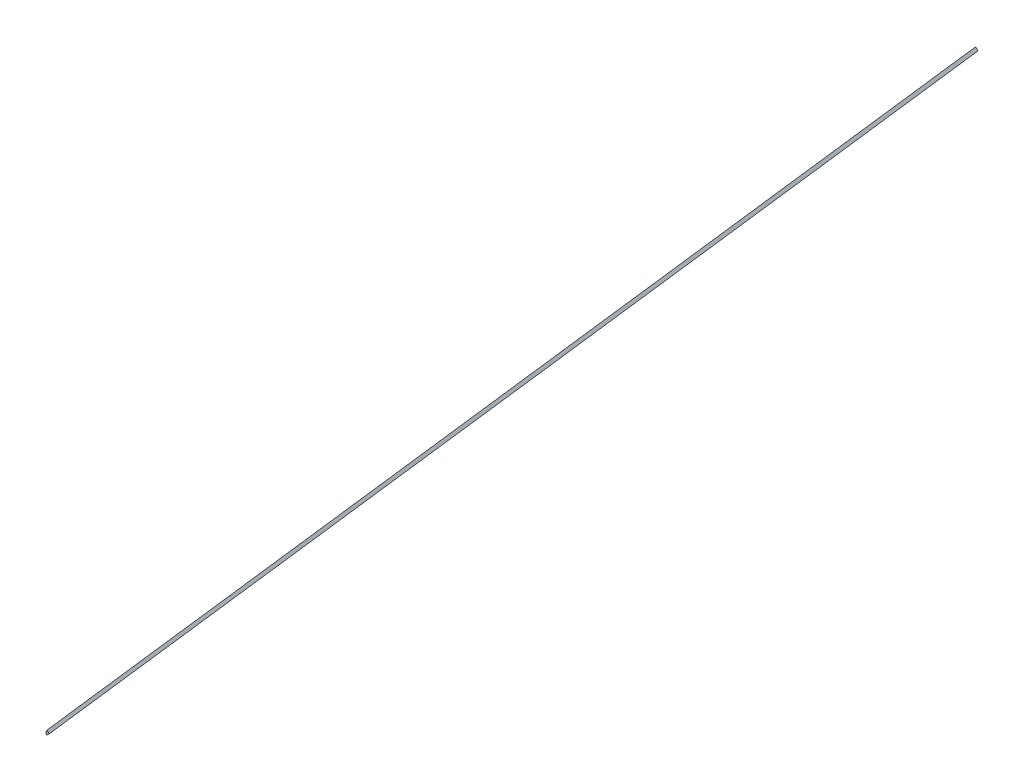
ISO-10303-21;
HEADER;
FILE_DESCRIPTION(('STEP AP214'),'2;1');
FILE_NAME('part.step','',(''),(''),'','','');
FILE_SCHEMA(('AUTOMOTIVE_DESIGN { 1 0 10303 214 1 1 1 1 }'));
ENDSEC;
DATA;
#1=APPLICATION_CONTEXT('core data for automotive mechanical design processes');
#2=APPLICATION_PROTOCOL_DEFINITION('international standard','automotive_design',2000,#1);
#3=PRODUCT_CONTEXT('',#1,'mechanical');
#4=PRODUCT('Part','Part','',(#3));
#5=PRODUCT_RELATED_PRODUCT_CATEGORY('part','',(#4));
#6=PRODUCT_DEFINITION_FORMATION('','',#4);
#7=PRODUCT_DEFINITION_CONTEXT('part definition',#1,'design');
#8=PRODUCT_DEFINITION('design','',#6,#7);
#9=PRODUCT_DEFINITION_SHAPE('','',#8);
#10=(LENGTH_UNIT() NAMED_UNIT(*) SI_UNIT(.MILLI.,.METRE.));
#11=(NAMED_UNIT(*) PLANE_ANGLE_UNIT() SI_UNIT($,.RADIAN.));
#12=(NAMED_UNIT(*) SI_UNIT($,.STERADIAN.) SOLID_ANGLE_UNIT());
#13=UNCERTAINTY_MEASURE_WITH_UNIT(LENGTH_MEASURE(1.E-05),#10,'distance_accuracy_value','');
#14=(GEOMETRIC_REPRESENTATION_CONTEXT(3) GLOBAL_UNCERTAINTY_ASSIGNED_CONTEXT((#13)) GLOBAL_UNIT_ASSIGNED_CONTEXT((#10,
#11,#12)) REPRESENTATION_CONTEXT('',''));
#15=CARTESIAN_POINT('',(0.,0.,0.));
#16=DIRECTION('',(0.,0.,1.));
#17=DIRECTION('',(1.,0.,0.));
#18=AXIS2_PLACEMENT_3D('',#15,#16,#17);
#19=CARTESIAN_POINT('',(114.57260961941,-0.0622199366800662,329.));
#20=CARTESIAN_POINT('',(114.4,-0.06856,0.));
#21=CARTESIAN_POINT('',(112.977295975491,-0.120816841951953,329.));
#22=CARTESIAN_POINT('',(111.965716629161,-0.157972807713173,0.));
#23=CARTESIAN_POINT('',(109.786644863781,-0.237979796076084,329.));
#24=CARTESIAN_POINT('',(107.097110694278,-0.336751805766281,0.));
#25=CARTESIAN_POINT('',(105.000693099298,-0.413750156151413,329.000000000001));
#26=CARTESIAN_POINT('',(99.7942412380696,-0.604959601121479,0.));
#27=CARTESIAN_POINT('',(100.214728756306,-0.589510986458513,329.));
#28=CARTESIAN_POINT('',(92.4913536383134,-0.8731494297109,0.));
#29=CARTESIAN_POINT('',(96.2264313571632,-0.735983254405373,329.));
#30=CARTESIAN_POINT('',(86.4056226452766,-1.09665710687671,0.));
#31=CARTESIAN_POINT('',(93.0357910844883,-0.85316110543344,329.));
#32=CARTESIAN_POINT('',(81.5370332937189,-1.27545083091915,0.));
#33=CARTESIAN_POINT('',(90.6428111354104,-0.941052950988877,329.));
#34=CARTESIAN_POINT('',(77.885594217603,-1.40956958634636,0.));
#35=CARTESIAN_POINT('',(88.2498328738692,-1.0289616927778,329.));
#36=CARTESIAN_POINT('',(74.2341544850718,-1.5437082159473,0.));
#37=CARTESIAN_POINT('',(85.856852391205,-1.11683664511502,329.));
#38=CARTESIAN_POINT('',(70.5827135432517,-1.67779370490371,0.));
#39=CARTESIAN_POINT('',(83.4638704721177,-1.2046573139067,329.));
#40=CARTESIAN_POINT('',(66.9312695396541,-1.81180573537152,0.));
#41=CARTESIAN_POINT('',(81.0708879975479,-1.29247078457698,329.));
#42=CARTESIAN_POINT('',(63.2798246772732,-1.94578905588669,0.));
#43=CARTESIAN_POINT('',(78.6779074851115,-1.38033351483244,329.));
#44=CARTESIAN_POINT('',(59.6283831410075,-2.07986597687277,0.));
#45=CARTESIAN_POINT('',(76.284934331329,-1.46839890937835,329.));
#46=CARTESIAN_POINT('',(55.9769530860873,-2.21425367726004,0.));
#47=CARTESIAN_POINT('',(73.8919664634316,-1.55660594759836,329.000000000001));
#48=CARTESIAN_POINT('',(52.3255302758724,-2.34883859679651,0.));
#49=CARTESIAN_POINT('',(71.4989899683453,-1.64458072330846,328.999999999999));
#50=CARTESIAN_POINT('',(48.6740949273067,-2.48308328284724,0.));
#51=CARTESIAN_POINT('',(69.105989839964,-1.73190836915481,329.000000000001));
#52=CARTESIAN_POINT('',(45.022623273531,-2.61633760751869,0.));
#53=CARTESIAN_POINT('',(66.7129651493619,-1.81856384168044,328.999999999999));
#54=CARTESIAN_POINT('',(41.3711135439631,-2.74854338410483,0.));
#55=CARTESIAN_POINT('',(64.3199669373025,-1.90594191039954,329.000000000001));
#56=CARTESIAN_POINT('',(37.7196460479609,-2.88191417837728,0.));
#57=CARTESIAN_POINT('',(62.3258668299447,-1.98053661442866,329.));
#58=CARTESIAN_POINT('',(34.6768527696352,-2.99567203272385,0.));
#59=CARTESIAN_POINT('',(60.7306395653596,-2.04158861078398,329.));
#60=CARTESIAN_POINT('',(32.2427036249245,-3.08892865656621,0.));
#61=CARTESIAN_POINT('',(59.5341984389728,-2.0868333620039,329.));
#62=CARTESIAN_POINT('',(30.4170537095853,-3.15787478213016,0.));
#63=CARTESIAN_POINT('',(58.3376895460393,-2.13030150456465,329.));
#64=CARTESIAN_POINT('',(28.5913075746204,-3.22423675912527,0.));
#65=CARTESIAN_POINT('',(57.1410810890218,-2.17088745999478,329.));
#66=CARTESIAN_POINT('',(26.7654048989622,-3.2861862573127,0.));
#67=CARTESIAN_POINT('',(55.9443412703829,-2.20748564982281,329.));
#68=CARTESIAN_POINT('',(24.9393037637721,-3.3420032780021,0.));
#69=CARTESIAN_POINT('',(54.7474529311727,-2.23888966087624,329.));
#70=CARTESIAN_POINT('',(23.1129754350255,-3.38993650770668,0.));
#71=CARTESIAN_POINT('',(53.5504153162138,-2.26397201099151,329.));
#72=CARTESIAN_POINT('',(21.2864190315302,-3.42820995119329,0.));
#73=CARTESIAN_POINT('',(52.353232928687,-2.28124339291768,328.999999999999));
#74=CARTESIAN_POINT('',(19.4596429108321,-3.4545494980358,0.));
#75=CARTESIAN_POINT('',(51.15595355233,-2.288861920351,329.000000000001));
#76=CARTESIAN_POINT('',(17.6327163554305,-3.46619351578578,0.));
#77=CARTESIAN_POINT('',(49.9586406141466,-2.28571853254573,329.));
#78=CARTESIAN_POINT('',(15.8057424311789,-3.46135030596471,0.));
#79=CARTESIAN_POINT('',(48.7614456222737,-2.26913668236569,328.999999999999));
#80=CARTESIAN_POINT('',(13.9789412855685,-3.43617298193985,0.));
#81=CARTESIAN_POINT('',(47.5644880850567,-2.23954580418405,329.000000000001));
#82=CARTESIAN_POINT('',(12.1525159866253,-3.39081697985119,0.));
#83=CARTESIAN_POINT('',(46.3681294391765,-2.19096327836138,328.999999999999));
#84=CARTESIAN_POINT('',(10.3269829850202,-3.31692842661875,0.));
#85=CARTESIAN_POINT('',(45.1723870805993,-2.13077185247814,329.000000000001));
#86=CARTESIAN_POINT('',(8.50241829521622,-3.22500915813475,0.));
#87=CARTESIAN_POINT('',(44.1766473883666,-2.06485136570954,328.999999999999));
#88=CARTESIAN_POINT('',(6.98300428865084,-3.12433212750466,0.));
#89=CARTESIAN_POINT('',(43.3830893437349,-1.97750102636705,329.000000000001));
#90=CARTESIAN_POINT('',(5.77213418222719,-2.99109577573727,0.));
#91=CARTESIAN_POINT('',(42.7903884171788,-1.89255413261195,328.999999999999));
#92=CARTESIAN_POINT('',(4.86771256745936,-2.86147635484054,0.));
#93=CARTESIAN_POINT('',(42.2018621119385,-1.78259761794642,329.000000000001));
#94=CARTESIAN_POINT('',(3.96972156813326,-2.69356724495905,0.));
#95=CARTESIAN_POINT('',(41.6144368512239,-1.66711733291326,328.999999999999));
#96=CARTESIAN_POINT('',(3.07329938019767,-2.5176539368822,0.));
#97=CARTESIAN_POINT('',(41.030721908302,-1.53296410466494,329.000000000001));
#98=CARTESIAN_POINT('',(2.18268391666198,-2.3127837560272,0.));
#99=CARTESIAN_POINT('',(40.5658570608416,-1.34296250191487,328.999999999999));
#100=CARTESIAN_POINT('',(1.47329929331152,-2.02281116106069,0.));
#101=CARTESIAN_POINT('',(40.2328838259331,-1.12111197664618,329.));
#102=CARTESIAN_POINT('',(0.965300946177489,-1.68427874419331,0.));
#103=CARTESIAN_POINT('',(40.0045523416234,-0.926760940944612,329.));
#104=CARTESIAN_POINT('',(0.616853662639164,-1.38773413128347,0.));
#105=CARTESIAN_POINT('',(39.8058884927858,-0.701609182245043,329.));
#106=CARTESIAN_POINT('',(0.313781760209367,-1.04410645837054,0.));
#107=CARTESIAN_POINT('',(39.6506080929225,-0.443706027629307,329.));
#108=CARTESIAN_POINT('',(0.0769541024066916,-0.650538017604325,0.));
#109=CARTESIAN_POINT('',(39.5764905355394,-0.148134503442184,329.));
#110=CARTESIAN_POINT('',(-0.0364245156961572,-0.199715317390292,0.));
#111=CARTESIAN_POINT('',(39.6212379263324,0.152906641389699,329.));
#112=CARTESIAN_POINT('',(0.0320651688817571,0.259740207343021,0.));
#113=CARTESIAN_POINT('',(39.7462731745835,0.426434812966566,329.));
#114=CARTESIAN_POINT('',(0.222717607662432,0.677061995084372,0.));
#115=CARTESIAN_POINT('',(39.9118284437912,0.676489937329452,329.));
#116=CARTESIAN_POINT('',(0.475409900417133,1.05859895915268,0.));
#117=CARTESIAN_POINT('',(40.1020297991035,0.907946183502351,329.));
#118=CARTESIAN_POINT('',(0.765550841982641,1.41183330248373,0.));
#119=CARTESIAN_POINT('',(40.3058904903587,1.12719115072782,329.));
#120=CARTESIAN_POINT('',(1.07673483260303,1.74628416301866,0.));
#121=CARTESIAN_POINT('',(40.5170780992003,1.33935694664796,329.));
#122=CARTESIAN_POINT('',(1.39880128657276,2.07019260086103,0.));
#123=CARTESIAN_POINT('',(40.7305626383487,1.54914088404984,329.));
#124=CARTESIAN_POINT('',(1.72484435432684,2.39003706317112,0.));
#125=CARTESIAN_POINT('',(40.9491748450726,1.75369770525246,329.));
#126=CARTESIAN_POINT('',(2.05806352461083,2.70249872806248,0.));
#127=CARTESIAN_POINT('',(41.2491898335489,2.01693149821586,329.));
#128=CARTESIAN_POINT('',(2.51618795565956,3.10386363754482,0.));
#129=CARTESIAN_POINT('',(41.6433845733717,2.32338414751801,329.));
#130=CARTESIAN_POINT('',(3.11744388388253,3.57170414689077,0.));
#131=CARTESIAN_POINT('',(42.1419159584038,2.65541038243405,329.));
#132=CARTESIAN_POINT('',(3.87827233736804,4.07822471273745,0.));
#133=CARTESIAN_POINT('',(42.6603325762503,2.95527445622198,329.));
#134=CARTESIAN_POINT('',(4.66927623600314,4.53582075141618,0.));
#135=CARTESIAN_POINT('',(43.1920051006209,3.23067304723329,329.));
#136=CARTESIAN_POINT('',(5.48057328365004,4.95603831197717,0.));
#137=CARTESIAN_POINT('',(43.73461712113,3.48384959688034,329.000000000001));
#138=CARTESIAN_POINT('',(6.30853823898846,5.34236268864598,0.));
#139=CARTESIAN_POINT('',(44.2853103695626,3.71876278425974,328.999999999999));
#140=CARTESIAN_POINT('',(7.14883728112551,5.70082045708303,0.));
#141=CARTESIAN_POINT('',(44.842102539349,3.93881445027894,329.));
#142=CARTESIAN_POINT('',(7.99844900100825,6.03659176034702,0.));
#143=CARTESIAN_POINT('',(45.4037436656897,4.14611278204335,329.));
#144=CARTESIAN_POINT('',(8.85544440881743,6.3529290932593,0.));
#145=CARTESIAN_POINT('',(45.9688602827349,4.34370744577013,329.));
#146=CARTESIAN_POINT('',(9.71777798239826,6.65438937250343,0.));
#147=CARTESIAN_POINT('',(46.5371284585512,4.53207887325267,329.));
#148=CARTESIAN_POINT('',(10.5848518324099,6.94191487900306,0.));
#149=CARTESIAN_POINT('',(47.2989015018565,4.77055534918493,329.));
#150=CARTESIAN_POINT('',(11.7472766809127,7.30570333780045,0.));
#151=CARTESIAN_POINT('',(48.2585469423734,5.04413868204417,329.));
#152=CARTESIAN_POINT('',(13.2115681037735,7.72323418873163,0.));
#153=CARTESIAN_POINT('',(49.4194455039909,5.33759135782374,329.));
#154=CARTESIAN_POINT('',(14.9829959141197,8.17097094627978,0.));
#155=CARTESIAN_POINT('',(50.5876889588109,5.60017543141388,329.));
#156=CARTESIAN_POINT('',(16.7656063461902,8.57166989486869,0.));
#157=CARTESIAN_POINT('',(51.7618910786936,5.83463957492898,329.));
#158=CARTESIAN_POINT('',(18.5573221255501,8.92942802521701,0.));
#159=CARTESIAN_POINT('',(52.9413793027427,6.04087523248973,329.));
#160=CARTESIAN_POINT('',(20.357097215315,9.24412694329611,0.));
#161=CARTESIAN_POINT('',(54.1256039736483,6.21798437376885,328.999999999999));
#162=CARTESIAN_POINT('',(22.1641029633317,9.51437922323504,0.));
#163=CARTESIAN_POINT('',(55.7101440829799,6.41328251131465,329.000000000001));
#164=CARTESIAN_POINT('',(24.581947434041,9.81237724369643,0.));
#165=CARTESIAN_POINT('',(57.6983353941993,6.58884014267491,328.999999999999));
#166=CARTESIAN_POINT('',(27.6157220253602,10.0802867880787,0.));
#167=CARTESIAN_POINT('',(60.089648548173,6.7178868839627,329.));
#168=CARTESIAN_POINT('',(31.2646245807487,10.2771026229954,0.));
#169=CARTESIAN_POINT('',(62.4830008435416,6.79713214430168,329.));
#170=CARTESIAN_POINT('',(34.9166302660792,10.3980954427901,0.));
#171=CARTESIAN_POINT('',(64.8771108097576,6.8473589228501,329.));
#172=CARTESIAN_POINT('',(38.5697944561475,10.4747486999319,0.));
#173=CARTESIAN_POINT('',(67.2717857562776,6.85811026179045,329.));
#174=CARTESIAN_POINT('',(42.2238222521298,10.4911444745235,0.));
#175=CARTESIAN_POINT('',(69.6662566295519,6.82456608957842,329.));
#176=CARTESIAN_POINT('',(45.8775382661358,10.4399604287515,0.));
#177=CARTESIAN_POINT('',(72.0595159941657,6.74076018787565,329.));
#178=CARTESIAN_POINT('',(49.5294044274174,10.3120908518743,0.));
#179=CARTESIAN_POINT('',(74.4507854867059,6.61312441778202,329.));
#180=CARTESIAN_POINT('',(53.178236653511,10.1173287938002,0.));
#181=CARTESIAN_POINT('',(76.83962110388,6.44606051592298,329.));
#182=CARTESIAN_POINT('',(56.8233498066736,9.86239123421157,0.));
#183=CARTESIAN_POINT('',(79.2257994806511,6.24485556975728,329.));
#184=CARTESIAN_POINT('',(60.4644197278447,9.55540656456613,0.));
#185=CARTESIAN_POINT('',(81.608883892125,6.00968462430416,329.));
#186=CARTESIAN_POINT('',(64.1007467162242,9.19649996426467,0.));
#187=CARTESIAN_POINT('',(83.9884067169117,5.74098583428185,329.));
#188=CARTESIAN_POINT('',(67.7316796667099,8.78660201096427,0.));
#189=CARTESIAN_POINT('',(86.3639430060132,5.43895442797606,329.));
#190=CARTESIAN_POINT('',(71.35645846618,8.32555431852534,0.));
#191=CARTESIAN_POINT('',(88.7353798020637,5.10654326179853,329.));
#192=CARTESIAN_POINT('',(74.9750949806674,7.81858317834956,0.));
#193=CARTESIAN_POINT('',(91.1029623317014,4.74754064005611,329.));
#194=CARTESIAN_POINT('',(78.587697519638,7.27053006377924,0.));
#195=CARTESIAN_POINT('',(93.4669358215645,4.36573486705565,329.));
#196=CARTESIAN_POINT('',(82.1949389593251,6.68807069894766,0.));
#197=CARTESIAN_POINT('',(96.6140720283502,3.82758553402491,329.));
#198=CARTESIAN_POINT('',(86.9971156579425,5.86690602257278,0.));
#199=CARTESIAN_POINT('',(100.5389082124,3.10287561201863,329.));
#200=CARTESIAN_POINT('',(92.98602152733,4.761034593382,0.));
#201=CARTESIAN_POINT('',(105.23248636945,2.15016018644571,329.));
#202=CARTESIAN_POINT('',(100.147932525585,3.30731157548085,0.));
#203=CARTESIAN_POINT('',(109.912024284167,1.13032636467303,329.));
#204=CARTESIAN_POINT('',(107.288427475213,1.75113882040688,0.));
#205=CARTESIAN_POINT('',(113.019270648536,0.395869046271625,329.));
#206=CARTESIAN_POINT('',(112.029765632302,0.630436336958154,0.));
#207=CARTESIAN_POINT('',(114.600066449668,0.0211332115694607,329.));
#208=CARTESIAN_POINT('',(114.441896278871,0.0586282700306697,0.));
#209=CARTESIAN_POINT('',(114.654664571062,0.00819044402219781,329.));
#210=CARTESIAN_POINT('',(114.525207356504,0.03887894744609,0.));
#211=CARTESIAN_POINT('',(114.736719522714,-0.0112611073904201,329.));
#212=CARTESIAN_POINT('',(114.650414713008,0.00919789489218184,0.));
#213=CARTESIAN_POINT('',(114.818774474365,-0.0307126588030327,329.));
#214=CARTESIAN_POINT('',(114.775622069512,-0.0204831576617346,0.));
#215=CARTESIAN_POINT('',(114.873477775466,-0.0436803597447778,329.));
#216=CARTESIAN_POINT('',(114.859093640515,-0.0402705260310117,0.));
#217=CARTESIAN_POINT('',(114.900829426016,-0.0501642102156497,329.));
#218=CARTESIAN_POINT('',(114.900829426016,-0.0501642102156497,0.));
#219=B_SPLINE_SURFACE_WITH_KNOTS('',3,1,((#19,#20),(#21,#22),(#23,#24),(#25,#26),(#27,#28),(#29,
#30),(#31,#32),(#33,#34),(#35,#36),(#37,#38),(#39,#40),(#41,#42),(#43,#44),(#45,#46),(#47,#48),
(#49,#50),(#51,#52),(#53,#54),(#55,#56),(#57,#58),(#59,#60),(#61,#62),(#63,#64),(#65,#66),(#67,
#68),(#69,#70),(#71,#72),(#73,#74),(#75,#76),(#77,#78),(#79,#80),(#81,#82),(#83,#84),(#85,#86),
(#87,#88),(#89,#90),(#91,#92),(#93,#94),(#95,#96),(#97,#98),(#99,#100),(#101,#102),(#103,#104),
(#105,#106),(#107,#108),(#109,#110),(#111,#112),(#113,#114),(#115,#116),(#117,#118),(#119,#120),
(#121,#122),(#123,#124),(#125,#126),(#127,#128),(#129,#130),(#131,#132),(#133,#134),(#135,#136),
(#137,#138),(#139,#140),(#141,#142),(#143,#144),(#145,#146),(#147,#148),(#149,#150),(#151,#152),
(#153,#154),(#155,#156),(#157,#158),(#159,#160),(#161,#162),(#163,#164),(#165,#166),(#167,#168),
(#169,#170),(#171,#172),(#173,#174),(#175,#176),(#177,#178),(#179,#180),(#181,#182),(#183,#184),
(#185,#186),(#187,#188),(#189,#190),(#191,#192),(#193,#194),(#195,#196),(#197,#198),(#199,#200),
(#201,#202),(#203,#204),(#205,#206),(#207,#208),(#209,#210),(#211,#212),(#213,#214),(#215,#216),
(#217,#218)),.UNSPECIFIED.,.F.,.F.,.F.,(4,1,1,1,1,1,1,1,1,1,1,1,1,1,1,1,1,1,1,1,1,1,1,1,1,1,1,1,
1,1,1,1,1,1,1,1,1,1,1,1,1,1,1,1,1,1,1,1,1,1,1,1,1,1,1,1,1,1,1,1,1,1,1,1,1,1,1,1,1,1,1,1,1,1,1,1,
1,1,1,1,1,1,1,1,1,1,1,1,1,1,1,1,2,1,1,1,4),(2,2),(0.,0.0311811053211745,0.0623622106423489,
0.0935433159635234,0.124724421284698,0.140314973945285,0.155905526605872,0.17149607926646,
0.187086631927047,0.202677184587634,0.218267737248221,0.233858289908809,0.249448842569396,
0.265039395229983,0.28062994789057,0.296220500551158,0.311811053211745,0.327401605872332,
0.342992158532919,0.350787434863213,0.358582711193506,0.3663779875238,0.374173263854094,
0.381968540184387,0.389763816514681,0.397559092844974,0.405354369175268,0.413149645505562,
0.420944921835855,0.428740198166149,0.436535474496443,0.444330750826736,0.45212602715703,
0.459921303487323,0.46381894165247,0.467716579817617,0.471614217982764,0.475511856147911,
0.479409494313058,0.483307132478204,0.485255951560778,0.487204770643351,0.489153589725925,
0.491102408808498,0.493051227891071,0.495000046973645,0.496948866056218,0.498897685138791,
0.500846504221365,0.502795323303939,0.504744142386512,0.506692961469085,0.508641780551659,
0.510590599634232,0.514488237799379,0.518385875964525,0.522283514129673,0.526181152294819,
0.530078790459966,0.533976428625113,0.53787406679026,0.541771704955407,0.545669343120553,
0.5495669812857,0.553464619450847,0.561259895781141,0.569055172111434,0.576850448441728,
0.584645724772021,0.592441001102315,0.600236277432609,0.608031553762902,0.62362210642349,
0.639212659084077,0.654803211744664,0.670393764405251,0.685984317065839,0.701574869726425,
0.717165422387013,0.7327559750476,0.748346527708187,0.763937080368774,0.779527633029362,
0.795118185689949,0.810708738350536,0.826299291011123,0.841889843671711,0.857480396332298,
0.873070948992885,0.90425205431406,0.935433159635234,0.966614264956409,0.997795370277583,
0.998346527708187,0.998897685138791,0.999448842569396,1.),(0.,1.),.UNSPECIFIED.);
#220=CARTESIAN_POINT('',(114.4,-0.06856,0.));
#221=CARTESIAN_POINT('',(111.965716629161,-0.157972807713173,0.));
#222=CARTESIAN_POINT('',(107.097110694278,-0.336751805766281,0.));
#223=CARTESIAN_POINT('',(99.7942412380696,-0.604959601121479,0.));
#224=CARTESIAN_POINT('',(92.4913536383134,-0.8731494297109,0.));
#225=CARTESIAN_POINT('',(86.4056226452766,-1.09665710687671,0.));
#226=CARTESIAN_POINT('',(81.5370332937189,-1.27545083091915,0.));
#227=CARTESIAN_POINT('',(77.885594217603,-1.40956958634636,0.));
#228=CARTESIAN_POINT('',(74.2341544850718,-1.5437082159473,0.));
#229=CARTESIAN_POINT('',(70.5827135432517,-1.67779370490371,0.));
#230=CARTESIAN_POINT('',(66.9312695396541,-1.81180573537152,0.));
#231=CARTESIAN_POINT('',(63.2798246772732,-1.94578905588669,0.));
#232=CARTESIAN_POINT('',(59.6283831410075,-2.07986597687277,0.));
#233=CARTESIAN_POINT('',(55.9769530860873,-2.21425367726004,0.));
#234=CARTESIAN_POINT('',(52.3255302758724,-2.34883859679651,0.));
#235=CARTESIAN_POINT('',(48.6740949273067,-2.48308328284724,0.));
#236=CARTESIAN_POINT('',(45.022623273531,-2.61633760751869,0.));
#237=CARTESIAN_POINT('',(41.3711135439631,-2.74854338410483,0.));
#238=CARTESIAN_POINT('',(37.7196460479609,-2.88191417837728,0.));
#239=CARTESIAN_POINT('',(34.6768527696352,-2.99567203272385,0.));
#240=CARTESIAN_POINT('',(32.2427036249245,-3.08892865656621,0.));
#241=CARTESIAN_POINT('',(30.4170537095853,-3.15787478213016,0.));
#242=CARTESIAN_POINT('',(28.5913075746204,-3.22423675912527,0.));
#243=CARTESIAN_POINT('',(26.7654048989622,-3.2861862573127,0.));
#244=CARTESIAN_POINT('',(24.9393037637721,-3.3420032780021,0.));
#245=CARTESIAN_POINT('',(23.1129754350255,-3.38993650770668,0.));
#246=CARTESIAN_POINT('',(21.2864190315302,-3.42820995119329,0.));
#247=CARTESIAN_POINT('',(19.4596429108321,-3.4545494980358,0.));
#248=CARTESIAN_POINT('',(17.6327163554305,-3.46619351578578,0.));
#249=CARTESIAN_POINT('',(15.8057424311789,-3.46135030596471,0.));
#250=CARTESIAN_POINT('',(13.9789412855685,-3.43617298193985,0.));
#251=CARTESIAN_POINT('',(12.1525159866253,-3.39081697985119,0.));
#252=CARTESIAN_POINT('',(10.3269829850202,-3.31692842661875,0.));
#253=CARTESIAN_POINT('',(8.50241829521622,-3.22500915813475,0.));
#254=CARTESIAN_POINT('',(6.98300428865084,-3.12433212750466,0.));
#255=CARTESIAN_POINT('',(5.77213418222719,-2.99109577573727,0.));
#256=CARTESIAN_POINT('',(4.86771256745936,-2.86147635484054,0.));
#257=CARTESIAN_POINT('',(3.96972156813326,-2.69356724495905,0.));
#258=CARTESIAN_POINT('',(3.07329938019767,-2.5176539368822,0.));
#259=CARTESIAN_POINT('',(2.18268391666198,-2.3127837560272,0.));
#260=CARTESIAN_POINT('',(1.47329929331152,-2.02281116106069,0.));
#261=CARTESIAN_POINT('',(0.965300946177489,-1.68427874419331,0.));
#262=CARTESIAN_POINT('',(0.616853662639164,-1.38773413128347,0.));
#263=CARTESIAN_POINT('',(0.313781760209367,-1.04410645837054,0.));
#264=CARTESIAN_POINT('',(0.0769541024066916,-0.650538017604325,0.));
#265=CARTESIAN_POINT('',(-0.0364245156961572,-0.199715317390292,0.));
#266=CARTESIAN_POINT('',(0.0320651688817571,0.259740207343021,0.));
#267=CARTESIAN_POINT('',(0.222717607662432,0.677061995084372,0.));
#268=CARTESIAN_POINT('',(0.475409900417133,1.05859895915268,0.));
#269=CARTESIAN_POINT('',(0.765550841982641,1.41183330248373,0.));
#270=CARTESIAN_POINT('',(1.07673483260303,1.74628416301866,0.));
#271=CARTESIAN_POINT('',(1.39880128657276,2.07019260086103,0.));
#272=CARTESIAN_POINT('',(1.72484435432684,2.39003706317112,0.));
#273=CARTESIAN_POINT('',(2.05806352461083,2.70249872806248,0.));
#274=CARTESIAN_POINT('',(2.51618795565956,3.10386363754482,0.));
#275=CARTESIAN_POINT('',(3.11744388388253,3.57170414689077,0.));
#276=CARTESIAN_POINT('',(3.87827233736804,4.07822471273745,0.));
#277=CARTESIAN_POINT('',(4.66927623600314,4.53582075141618,0.));
#278=CARTESIAN_POINT('',(5.48057328365004,4.95603831197717,0.));
#279=CARTESIAN_POINT('',(6.30853823898846,5.34236268864598,0.));
#280=CARTESIAN_POINT('',(7.14883728112551,5.70082045708303,0.));
#281=CARTESIAN_POINT('',(7.99844900100825,6.03659176034702,0.));
#282=CARTESIAN_POINT('',(8.85544440881743,6.3529290932593,0.));
#283=CARTESIAN_POINT('',(9.71777798239826,6.65438937250343,0.));
#284=CARTESIAN_POINT('',(10.5848518324099,6.94191487900306,0.));
#285=CARTESIAN_POINT('',(11.7472766809127,7.30570333780045,0.));
#286=CARTESIAN_POINT('',(13.2115681037735,7.72323418873163,0.));
#287=CARTESIAN_POINT('',(14.9829959141197,8.17097094627978,0.));
#288=CARTESIAN_POINT('',(16.7656063461902,8.57166989486869,0.));
#289=CARTESIAN_POINT('',(18.5573221255501,8.92942802521701,0.));
#290=CARTESIAN_POINT('',(20.357097215315,9.24412694329611,0.));
#291=CARTESIAN_POINT('',(22.1641029633317,9.51437922323504,0.));
#292=CARTESIAN_POINT('',(24.581947434041,9.81237724369643,0.));
#293=CARTESIAN_POINT('',(27.6157220253602,10.0802867880787,0.));
#294=CARTESIAN_POINT('',(31.2646245807487,10.2771026229954,0.));
#295=CARTESIAN_POINT('',(34.9166302660792,10.3980954427901,0.));
#296=CARTESIAN_POINT('',(38.5697944561475,10.4747486999319,0.));
#297=CARTESIAN_POINT('',(42.2238222521298,10.4911444745235,0.));
#298=CARTESIAN_POINT('',(45.8775382661358,10.4399604287515,0.));
#299=CARTESIAN_POINT('',(49.5294044274174,10.3120908518743,0.));
#300=CARTESIAN_POINT('',(53.178236653511,10.1173287938002,0.));
#301=CARTESIAN_POINT('',(56.8233498066736,9.86239123421157,0.));
#302=CARTESIAN_POINT('',(60.4644197278447,9.55540656456613,0.));
#303=CARTESIAN_POINT('',(64.1007467162242,9.19649996426467,0.));
#304=CARTESIAN_POINT('',(67.7316796667099,8.78660201096427,0.));
#305=CARTESIAN_POINT('',(71.35645846618,8.32555431852534,0.));
#306=CARTESIAN_POINT('',(74.9750949806674,7.81858317834956,0.));
#307=CARTESIAN_POINT('',(78.587697519638,7.27053006377924,0.));
#308=CARTESIAN_POINT('',(82.1949389593251,6.68807069894766,0.));
#309=CARTESIAN_POINT('',(86.9971156579425,5.86690602257278,0.));
#310=CARTESIAN_POINT('',(92.98602152733,4.761034593382,0.));
#311=CARTESIAN_POINT('',(100.147932525585,3.30731157548085,0.));
#312=CARTESIAN_POINT('',(107.288427475213,1.75113882040688,0.));
#313=CARTESIAN_POINT('',(112.029765632302,0.630436336958154,0.));
#314=CARTESIAN_POINT('',(114.441896278871,0.0586282700306697,0.));
#315=CARTESIAN_POINT('',(114.525207356504,0.03887894744609,0.));
#316=CARTESIAN_POINT('',(114.650414713008,0.00919789489218184,0.));
#317=CARTESIAN_POINT('',(114.775622069512,-0.0204831576617346,0.));
#318=CARTESIAN_POINT('',(114.859093640515,-0.0402705260310117,0.));
#319=CARTESIAN_POINT('',(114.900829426016,-0.0501642102156497,0.));
#320=B_SPLINE_CURVE_WITH_KNOTS('',3,(#220,#221,#222,#223,#224,#225,#226,#227,#228,#229,#230,
#231,#232,#233,#234,#235,#236,#237,#238,#239,#240,#241,#242,#243,#244,#245,#246,#247,#248,#249,
#250,#251,#252,#253,#254,#255,#256,#257,#258,#259,#260,#261,#262,#263,#264,#265,#266,#267,#268,
#269,#270,#271,#272,#273,#274,#275,#276,#277,#278,#279,#280,#281,#282,#283,#284,#285,#286,#287,
#288,#289,#290,#291,#292,#293,#294,#295,#296,#297,#298,#299,#300,#301,#302,#303,#304,#305,#306,
#307,#308,#309,#310,#311,#312,#313,#314,#315,#316,#317,#318,#319),.UNSPECIFIED.,.F.,.F.,(4,1,1,
1,1,1,1,1,1,1,1,1,1,1,1,1,1,1,1,1,1,1,1,1,1,1,1,1,1,1,1,1,1,1,1,1,1,1,1,1,1,1,1,1,1,1,1,1,1,1,1,
1,1,1,1,1,1,1,1,1,1,1,1,1,1,1,1,1,1,1,1,1,1,1,1,1,1,1,1,1,1,1,1,1,1,1,1,1,1,1,1,1,2,1,1,1,4),
(0.,0.0311811053211745,0.0623622106423489,0.0935433159635234,0.124724421284698,
0.140314973945285,0.155905526605872,0.17149607926646,0.187086631927047,0.202677184587634,
0.218267737248221,0.233858289908809,0.249448842569396,0.265039395229983,0.28062994789057,
0.296220500551158,0.311811053211745,0.327401605872332,0.342992158532919,0.350787434863213,
0.358582711193506,0.3663779875238,0.374173263854094,0.381968540184387,0.389763816514681,
0.397559092844974,0.405354369175268,0.413149645505562,0.420944921835855,0.428740198166149,
0.436535474496443,0.444330750826736,0.45212602715703,0.459921303487323,0.46381894165247,
0.467716579817617,0.471614217982764,0.475511856147911,0.479409494313058,0.483307132478204,
0.485255951560778,0.487204770643351,0.489153589725925,0.491102408808498,0.493051227891071,
0.495000046973645,0.496948866056218,0.498897685138791,0.500846504221365,0.502795323303939,
0.504744142386512,0.506692961469085,0.508641780551659,0.510590599634232,0.514488237799379,
0.518385875964525,0.522283514129673,0.526181152294819,0.530078790459966,0.533976428625113,
0.53787406679026,0.541771704955407,0.545669343120553,0.5495669812857,0.553464619450847,
0.561259895781141,0.569055172111434,0.576850448441728,0.584645724772021,0.592441001102315,
0.600236277432609,0.608031553762902,0.62362210642349,0.639212659084077,0.654803211744664,
0.670393764405251,0.685984317065839,0.701574869726425,0.717165422387013,0.7327559750476,
0.748346527708187,0.763937080368774,0.779527633029362,0.795118185689949,0.810708738350536,
0.826299291011123,0.841889843671711,0.857480396332298,0.873070948992885,0.90425205431406,
0.935433159635234,0.966614264956409,0.997795370277583,0.998346527708187,0.998897685138791,
0.999448842569396,1.),.UNSPECIFIED.);
#321=CARTESIAN_POINT('',(0.183179704683102,-0.816820295316895,0.));
#322=VERTEX_POINT('',#321);
#323=CARTESIAN_POINT('',(0.267876084416013,0.732124251684864,0.));
#324=VERTEX_POINT('',#323);
#325=EDGE_CURVE('E87',#322,#324,#320,.T.);
#326=CARTESIAN_POINT('',(0.183183361936027,-0.816816633922533,-2.4568206856276E-10));
#327=CARTESIAN_POINT('',(0.253657795368378,-0.81671996698746,0.584704155778153));
#328=CARTESIAN_POINT('',(0.324132336117454,-0.816623190691338,1.16940829884891));
#329=CARTESIAN_POINT('',(0.676505578439659,-0.816138760911092,4.09292894919773));
#330=CARTESIAN_POINT('',(0.958405895742906,-0.815749462528073,6.43174526145791));
#331=CARTESIAN_POINT('',(2.36791622705378,-0.813794102178374,18.1258257673499));
#332=CARTESIAN_POINT('',(3.49555247541546,-0.812201434907935,27.4810867945071));
#333=CARTESIAN_POINT('',(5.75088431681331,-0.808955887724225,46.1916016850195));
#334=CARTESIAN_POINT('',(6.87857990984947,-0.807303007810954,55.5468555483747));
#335=CARTESIAN_POINT('',(10.2617610324604,-0.80224865537793,83.6126057496995));
#336=CARTESIAN_POINT('',(12.5173409054496,-0.798751470165087,102.323090698199));
#337=CARTESIAN_POINT('',(15.9009238828002,-0.793289424901502,130.38879237874));
#338=CARTESIAN_POINT('',(17.0288204032088,-0.791432698572955,139.744021981726));
#339=CARTESIAN_POINT('',(19.3236285169373,-0.787577060191061,158.777440274885));
#340=CARTESIAN_POINT('',(20.490542767393,-0.785575452379359,168.455628644151));
#341=CARTESIAN_POINT('',(23.4079383035907,-0.780461611395866,192.651100303679));
#342=CARTESIAN_POINT('',(25.158473711901,-0.777294468768425,207.168377056536));
#343=CARTESIAN_POINT('',(28.6597635251703,-0.770743495925323,236.202949746008));
#344=CARTESIAN_POINT('',(30.4105179307912,-0.767359665038206,250.720245682544));
#345=CARTESIAN_POINT('',(34.7247820257032,-0.758719565518917,286.491717765425));
#346=CARTESIAN_POINT('',(37.2884299127777,-0.753323088839099,307.745877210325));
#347=CARTESIAN_POINT('',(39.8523810131294,-0.747618986870556,329.));
#348=B_SPLINE_CURVE_WITH_KNOTS('',3,(#326,#327,#328,#329,#330,#331,#332,#333,#334,#335,#336,
#337,#338,#339,#340,#341,#342,#343,#344,#345,#346,#347),.UNSPECIFIED.,.F.,.F.,(4,2,2,2,2,2,2,2,
2,2,4),(0.,1.76680798239421,8.83403991197409,37.1029676305431,65.3718953491452,121.909750788553,
150.178678507286,179.423527743136,223.290843330412,267.158294856529,331.382935910981),.UNSPECIFIED.);
#349=CARTESIAN_POINT('',(39.8523742895254,-0.747625710474639,329.));
#350=VERTEX_POINT('',#349);
#351=EDGE_CURVE('E122',#322,#350,#348,.T.);
#352=CARTESIAN_POINT('',(114.57260961941,-0.0622199366800662,329.));
#353=CARTESIAN_POINT('',(112.977295975491,-0.120816841951953,329.));
#354=CARTESIAN_POINT('',(109.786644863781,-0.237979796076084,329.));
#355=CARTESIAN_POINT('',(105.000693099298,-0.413750156151413,329.000000000001));
#356=CARTESIAN_POINT('',(100.214728756306,-0.589510986458513,329.));
#357=CARTESIAN_POINT('',(96.2264313571632,-0.735983254405373,329.));
#358=CARTESIAN_POINT('',(93.0357910844883,-0.85316110543344,329.));
#359=CARTESIAN_POINT('',(90.6428111354104,-0.941052950988877,329.));
#360=CARTESIAN_POINT('',(88.2498328738692,-1.0289616927778,329.));
#361=CARTESIAN_POINT('',(85.856852391205,-1.11683664511502,329.));
#362=CARTESIAN_POINT('',(83.4638704721177,-1.2046573139067,329.));
#363=CARTESIAN_POINT('',(81.0708879975479,-1.29247078457698,329.));
#364=CARTESIAN_POINT('',(78.6779074851115,-1.38033351483244,329.));
#365=CARTESIAN_POINT('',(76.284934331329,-1.46839890937835,329.));
#366=CARTESIAN_POINT('',(73.8919664634316,-1.55660594759836,329.000000000001));
#367=CARTESIAN_POINT('',(71.4989899683453,-1.64458072330846,328.999999999999));
#368=CARTESIAN_POINT('',(69.105989839964,-1.73190836915481,329.000000000001));
#369=CARTESIAN_POINT('',(66.7129651493619,-1.81856384168044,328.999999999999));
#370=CARTESIAN_POINT('',(64.3199669373025,-1.90594191039954,329.000000000001));
#371=CARTESIAN_POINT('',(62.3258668299447,-1.98053661442866,329.));
#372=CARTESIAN_POINT('',(60.7306395653596,-2.04158861078398,329.));
#373=CARTESIAN_POINT('',(59.5341984389728,-2.0868333620039,329.));
#374=CARTESIAN_POINT('',(58.3376895460393,-2.13030150456465,329.));
#375=CARTESIAN_POINT('',(57.1410810890218,-2.17088745999478,329.));
#376=CARTESIAN_POINT('',(55.9443412703829,-2.20748564982281,329.));
#377=CARTESIAN_POINT('',(54.7474529311727,-2.23888966087624,329.));
#378=CARTESIAN_POINT('',(53.5504153162138,-2.26397201099151,329.));
#379=CARTESIAN_POINT('',(52.353232928687,-2.28124339291768,328.999999999999));
#380=CARTESIAN_POINT('',(51.15595355233,-2.288861920351,329.000000000001));
#381=CARTESIAN_POINT('',(49.9586406141466,-2.28571853254573,329.));
#382=CARTESIAN_POINT('',(48.7614456222737,-2.26913668236569,328.999999999999));
#383=CARTESIAN_POINT('',(47.5644880850567,-2.23954580418405,329.000000000001));
#384=CARTESIAN_POINT('',(46.3681294391765,-2.19096327836138,328.999999999999));
#385=CARTESIAN_POINT('',(45.1723870805993,-2.13077185247814,329.000000000001));
#386=CARTESIAN_POINT('',(44.1766473883666,-2.06485136570954,328.999999999999));
#387=CARTESIAN_POINT('',(43.3830893437349,-1.97750102636705,329.000000000001));
#388=CARTESIAN_POINT('',(42.7903884171788,-1.89255413261195,328.999999999999));
#389=CARTESIAN_POINT('',(42.2018621119385,-1.78259761794642,329.000000000001));
#390=CARTESIAN_POINT('',(41.6144368512239,-1.66711733291326,328.999999999999));
#391=CARTESIAN_POINT('',(41.030721908302,-1.53296410466494,329.000000000001));
#392=CARTESIAN_POINT('',(40.5658570608416,-1.34296250191487,328.999999999999));
#393=CARTESIAN_POINT('',(40.2328838259331,-1.12111197664618,329.));
#394=CARTESIAN_POINT('',(40.0045523416234,-0.926760940944612,329.));
#395=CARTESIAN_POINT('',(39.8058884927858,-0.701609182245043,329.));
#396=CARTESIAN_POINT('',(39.6506080929225,-0.443706027629307,329.));
#397=CARTESIAN_POINT('',(39.5764905355394,-0.148134503442184,329.));
#398=CARTESIAN_POINT('',(39.6212379263324,0.152906641389699,329.));
#399=CARTESIAN_POINT('',(39.7462731745835,0.426434812966566,329.));
#400=CARTESIAN_POINT('',(39.9118284437912,0.676489937329452,329.));
#401=CARTESIAN_POINT('',(40.1020297991035,0.907946183502351,329.));
#402=CARTESIAN_POINT('',(40.3058904903587,1.12719115072782,329.));
#403=CARTESIAN_POINT('',(40.5170780992003,1.33935694664796,329.));
#404=CARTESIAN_POINT('',(40.7305626383487,1.54914088404984,329.));
#405=CARTESIAN_POINT('',(40.9491748450726,1.75369770525246,329.));
#406=CARTESIAN_POINT('',(41.2491898335489,2.01693149821586,329.));
#407=CARTESIAN_POINT('',(41.6433845733717,2.32338414751801,329.));
#408=CARTESIAN_POINT('',(42.1419159584038,2.65541038243405,329.));
#409=CARTESIAN_POINT('',(42.6603325762503,2.95527445622198,329.));
#410=CARTESIAN_POINT('',(43.1920051006209,3.23067304723329,329.));
#411=CARTESIAN_POINT('',(43.73461712113,3.48384959688034,329.000000000001));
#412=CARTESIAN_POINT('',(44.2853103695626,3.71876278425974,328.999999999999));
#413=CARTESIAN_POINT('',(44.842102539349,3.93881445027894,329.));
#414=CARTESIAN_POINT('',(45.4037436656897,4.14611278204335,329.));
#415=CARTESIAN_POINT('',(45.9688602827349,4.34370744577013,329.));
#416=CARTESIAN_POINT('',(46.5371284585512,4.53207887325267,329.));
#417=CARTESIAN_POINT('',(47.2989015018565,4.77055534918493,329.));
#418=CARTESIAN_POINT('',(48.2585469423734,5.04413868204417,329.));
#419=CARTESIAN_POINT('',(49.4194455039909,5.33759135782374,329.));
#420=CARTESIAN_POINT('',(50.5876889588109,5.60017543141388,329.));
#421=CARTESIAN_POINT('',(51.7618910786936,5.83463957492898,329.));
#422=CARTESIAN_POINT('',(52.9413793027427,6.04087523248973,329.));
#423=CARTESIAN_POINT('',(54.1256039736483,6.21798437376885,328.999999999999));
#424=CARTESIAN_POINT('',(55.7101440829799,6.41328251131465,329.000000000001));
#425=CARTESIAN_POINT('',(57.6983353941993,6.58884014267491,328.999999999999));
#426=CARTESIAN_POINT('',(60.089648548173,6.7178868839627,329.));
#427=CARTESIAN_POINT('',(62.4830008435416,6.79713214430168,329.));
#428=CARTESIAN_POINT('',(64.8771108097576,6.8473589228501,329.));
#429=CARTESIAN_POINT('',(67.2717857562776,6.85811026179045,329.));
#430=CARTESIAN_POINT('',(69.6662566295519,6.82456608957842,329.));
#431=CARTESIAN_POINT('',(72.0595159941657,6.74076018787565,329.));
#432=CARTESIAN_POINT('',(74.4507854867059,6.61312441778202,329.));
#433=CARTESIAN_POINT('',(76.83962110388,6.44606051592298,329.));
#434=CARTESIAN_POINT('',(79.2257994806511,6.24485556975728,329.));
#435=CARTESIAN_POINT('',(81.608883892125,6.00968462430416,329.));
#436=CARTESIAN_POINT('',(83.9884067169117,5.74098583428185,329.));
#437=CARTESIAN_POINT('',(86.3639430060132,5.43895442797606,329.));
#438=CARTESIAN_POINT('',(88.7353798020637,5.10654326179853,329.));
#439=CARTESIAN_POINT('',(91.1029623317014,4.74754064005611,329.));
#440=CARTESIAN_POINT('',(93.4669358215645,4.36573486705565,329.));
#441=CARTESIAN_POINT('',(96.6140720283502,3.82758553402491,329.));
#442=CARTESIAN_POINT('',(100.5389082124,3.10287561201863,329.));
#443=CARTESIAN_POINT('',(105.23248636945,2.15016018644571,329.));
#444=CARTESIAN_POINT('',(109.912024284167,1.13032636467303,329.));
#445=CARTESIAN_POINT('',(113.019270648536,0.395869046271625,329.));
#446=CARTESIAN_POINT('',(114.600066449668,0.0211332115694607,329.));
#447=CARTESIAN_POINT('',(114.654664571062,0.00819044402219781,329.));
#448=CARTESIAN_POINT('',(114.736719522714,-0.0112611073904201,329.));
#449=CARTESIAN_POINT('',(114.818774474365,-0.0307126588030327,329.));
#450=CARTESIAN_POINT('',(114.873477775466,-0.0436803597447778,329.));
#451=CARTESIAN_POINT('',(114.900829426016,-0.0501642102156497,329.));
#452=B_SPLINE_CURVE_WITH_KNOTS('',3,(#352,#353,#354,#355,#356,#357,#358,#359,#360,#361,#362,
#363,#364,#365,#366,#367,#368,#369,#370,#371,#372,#373,#374,#375,#376,#377,#378,#379,#380,#381,
#382,#383,#384,#385,#386,#387,#388,#389,#390,#391,#392,#393,#394,#395,#396,#397,#398,#399,#400,
#401,#402,#403,#404,#405,#406,#407,#408,#409,#410,#411,#412,#413,#414,#415,#416,#417,#418,#419,
#420,#421,#422,#423,#424,#425,#426,#427,#428,#429,#430,#431,#432,#433,#434,#435,#436,#437,#438,
#439,#440,#441,#442,#443,#444,#445,#446,#447,#448,#449,#450,#451),.UNSPECIFIED.,.F.,.F.,(4,1,1,
1,1,1,1,1,1,1,1,1,1,1,1,1,1,1,1,1,1,1,1,1,1,1,1,1,1,1,1,1,1,1,1,1,1,1,1,1,1,1,1,1,1,1,1,1,1,1,1,
1,1,1,1,1,1,1,1,1,1,1,1,1,1,1,1,1,1,1,1,1,1,1,1,1,1,1,1,1,1,1,1,1,1,1,1,1,1,1,1,1,2,1,1,1,4),
(0.,0.0311811053211745,0.0623622106423489,0.0935433159635234,0.124724421284698,
0.140314973945285,0.155905526605872,0.17149607926646,0.187086631927047,0.202677184587634,
0.218267737248221,0.233858289908809,0.249448842569396,0.265039395229983,0.28062994789057,
0.296220500551158,0.311811053211745,0.327401605872332,0.342992158532919,0.350787434863213,
0.358582711193506,0.3663779875238,0.374173263854094,0.381968540184387,0.389763816514681,
0.397559092844974,0.405354369175268,0.413149645505562,0.420944921835855,0.428740198166149,
0.436535474496443,0.444330750826736,0.45212602715703,0.459921303487323,0.46381894165247,
0.467716579817617,0.471614217982764,0.475511856147911,0.479409494313058,0.483307132478204,
0.485255951560778,0.487204770643351,0.489153589725925,0.491102408808498,0.493051227891071,
0.495000046973645,0.496948866056218,0.498897685138791,0.500846504221365,0.502795323303939,
0.504744142386512,0.506692961469085,0.508641780551659,0.510590599634232,0.514488237799379,
0.518385875964525,0.522283514129673,0.526181152294819,0.530078790459966,0.533976428625113,
0.53787406679026,0.541771704955407,0.545669343120553,0.5495669812857,0.553464619450847,
0.561259895781141,0.569055172111434,0.576850448441728,0.584645724772021,0.592441001102315,
0.600236277432609,0.608031553762902,0.62362210642349,0.639212659084077,0.654803211744664,
0.670393764405251,0.685984317065839,0.701574869726425,0.717165422387013,0.7327559750476,
0.748346527708187,0.763937080368774,0.779527633029362,0.795118185689949,0.810708738350536,
0.826299291011123,0.841889843671711,0.857480396332298,0.873070948992885,0.90425205431406,
0.935433159635234,0.966614264956409,0.997795370277583,0.998346527708187,0.998897685138791,
0.999448842569396,1.),.UNSPECIFIED.);
#453=CARTESIAN_POINT('',(39.920479468736,0.679520531264004,329.));
#454=VERTEX_POINT('',#453);
#455=EDGE_CURVE('E93',#350,#454,#452,.T.);
#456=CARTESIAN_POINT('',(39.9204785682858,0.679521431716549,329.));
#457=CARTESIAN_POINT('',(39.8499818706787,0.679640688199054,328.41529853208));
#458=CARTESIAN_POINT('',(39.7794853502089,0.679759764969541,327.830597042766));
#459=CARTESIAN_POINT('',(39.4270036291505,0.680354254720586,324.907089489755));
#460=CARTESIAN_POINT('',(39.1450210724354,0.680826985396981,322.568283106746));
#461=CARTESIAN_POINT('',(38.0644041900738,0.682627861401548,313.605392548853));
#462=CARTESIAN_POINT('',(37.2657892713569,0.683936317688814,306.981306030196));
#463=CARTESIAN_POINT('',(34.870007587564,0.687797697400416,287.109038857421));
#464=CARTESIAN_POINT('',(33.2729038948889,0.69028663167448,273.860850586856));
#465=CARTESIAN_POINT('',(30.078847867213,0.69511094308109,247.364455772389));
#466=CARTESIAN_POINT('',(28.4818955322123,0.697446320213637,234.116249228487));
#467=CARTESIAN_POINT('',(25.2881272572039,0.701978697801221,207.619819676685));
#468=CARTESIAN_POINT('',(23.6913113171963,0.704175698256258,194.371596668785));
#469=CARTESIAN_POINT('',(20.4978025458858,0.708444802111539,167.87513579523));
#470=CARTESIAN_POINT('',(18.9011097145829,0.710516905511785,154.626897929574));
#471=CARTESIAN_POINT('',(15.7078353985954,0.714548148445134,128.130408762029));
#472=CARTESIAN_POINT('',(14.1112539139108,0.716507287978238,114.882157460139));
#473=CARTESIAN_POINT('',(10.9181919097827,0.720323135542317,88.3856426745443));
#474=CARTESIAN_POINT('',(9.32171139033922,0.722179843573292,75.1373791908399));
#475=CARTESIAN_POINT('',(5.25540712078626,0.726790643686337,41.3925016290763));
#476=CARTESIAN_POINT('',(2.78564724929269,0.729479929574561,20.8958798446217));
#477=CARTESIAN_POINT('',(0.299947116444412,0.732089693197448,0.266164403337556));
#478=CARTESIAN_POINT('',(0.283911880141406,0.732106524708562,0.13308220191001));
#479=CARTESIAN_POINT('',(0.26787664783844,0.732123352161562,0.));
#480=B_SPLINE_CURVE_WITH_KNOTS('',3,(#456,#457,#458,#459,#460,#461,#462,#463,#464,#465,#466,
#467,#468,#469,#470,#471,#472,#473,#474,#475,#476,#477,#478,#479),.UNSPECIFIED.,.F.,.F.,(4,2,2,
2,2,2,2,2,2,2,2,4),(0.,1.7668079823942,8.83403991198046,28.8502030646176,68.8825293709734,
108.914855677042,148.94718198288,188.979508288534,229.011834594041,269.044160899429,
330.978812188852,331.380946510703),.UNSPECIFIED.);
#481=EDGE_CURVE('E153',#454,#324,#480,.T.);
#482=ORIENTED_EDGE('',*,*,#325,.F.);
#483=ORIENTED_EDGE('',*,*,#351,.T.);
#484=ORIENTED_EDGE('',*,*,#455,.T.);
#485=ORIENTED_EDGE('',*,*,#481,.T.);
#486=EDGE_LOOP('',(#482,#483,#484,#485));
#487=FACE_BOUND('',#486,.T.);
#488=ADVANCED_FACE('F82',(#487),#219,.T.);
#489=CARTESIAN_POINT('',(40.020161085699,0.806786694725448,329.));
#490=DIRECTION('',(-4.49796908122171E-10,1.22458198294049E-08,1.));
#491=DIRECTION('',(0.,-1.,1.22458198294049E-08));
#492=AXIS2_PLACEMENT_3D('',#489,#490,#491);
#493=PLANE('',#492);
#494=ORIENTED_EDGE('',*,*,#455,.F.);
#495=DIRECTION('',(0.707106781186549,0.707106781186546,0.));
#496=VECTOR('',#495,1.);
#497=CARTESIAN_POINT('',(29.3758342539453,-11.2241657460546,329.));
#498=LINE('',#497,#496);
#499=CARTESIAN_POINT('',(40.6,0.,329.));
#500=VERTEX_POINT('',#499);
#501=EDGE_CURVE('E109',#350,#500,#498,.T.);
#502=ORIENTED_EDGE('',*,*,#501,.T.);
#503=DIRECTION('',(-0.707106781186546,0.707106781186549,0.));
#504=VECTOR('',#503,1.);
#505=CARTESIAN_POINT('',(40.6,0.,329.));
#506=LINE('',#505,#504);
#507=EDGE_CURVE('E128',#500,#454,#506,.T.);
#508=ORIENTED_EDGE('',*,*,#507,.T.);
#509=EDGE_LOOP('',(#494,#502,#508));
#510=FACE_BOUND('',#509,.T.);
#511=ADVANCED_FACE('F174',(#510),#493,.T.);
#512=CARTESIAN_POINT('',(0.640669166447432,1.25744656086424,0.));
#513=DIRECTION('',(0.,0.,1.));
#514=DIRECTION('',(1.,0.,0.));
#515=AXIS2_PLACEMENT_3D('',#512,#513,#514);
#516=PLANE('',#515);
#517=DIRECTION('',(0.707106781186549,0.707106781186546,0.));
#518=VECTOR('',#517,1.);
#519=CARTESIAN_POINT('',(-10.2241657460547,-11.2241657460546,0.));
#520=LINE('',#519,#518);
#521=CARTESIAN_POINT('',(1.,0.,0.));
#522=VERTEX_POINT('',#521);
#523=EDGE_CURVE('E12',#322,#522,#520,.T.);
#524=ORIENTED_EDGE('',*,*,#523,.F.);
#525=ORIENTED_EDGE('',*,*,#325,.T.);
#526=DIRECTION('',(-0.707106781186546,0.707106781186549,0.));
#527=VECTOR('',#526,1.);
#528=CARTESIAN_POINT('',(1.,0.,0.));
#529=LINE('',#528,#527);
#530=EDGE_CURVE('E101',#522,#324,#529,.T.);
#531=ORIENTED_EDGE('',*,*,#530,.F.);
#532=EDGE_LOOP('',(#524,#525,#531));
#533=FACE_BOUND('',#532,.T.);
#534=ADVANCED_FACE('F84',(#533),#516,.F.);
#535=CARTESIAN_POINT('',(-10.2241657460547,-11.2241657460546,0.));
#536=DIRECTION('',(0.704559529161488,-0.70455952916149,-0.0848041256984648));
#537=DIRECTION('',(0.707106781186549,0.707106781186546,0.));
#538=AXIS2_PLACEMENT_3D('',#535,#536,#537);
#539=PLANE('',#538);
#540=ORIENTED_EDGE('',*,*,#523,.T.);
#541=DIRECTION('',(0.119502200179928,0.,0.992833935838293));
#542=VECTOR('',#541,1.);
#543=CARTESIAN_POINT('',(1.,0.,0.));
#544=LINE('',#543,#542);
#545=EDGE_CURVE('E121',#522,#500,#544,.T.);
#546=ORIENTED_EDGE('',*,*,#545,.T.);
#547=ORIENTED_EDGE('',*,*,#501,.F.);
#548=ORIENTED_EDGE('',*,*,#351,.F.);
#549=EDGE_LOOP('',(#540,#546,#547,#548));
#550=FACE_BOUND('',#549,.T.);
#551=ADVANCED_FACE('F120',(#550),#539,.T.);
#552=CARTESIAN_POINT('',(1.,0.,0.));
#553=DIRECTION('',(0.70455952916149,0.704559529161488,-0.0848041256984651));
#554=DIRECTION('',(-0.707106781186546,0.707106781186549,0.));
#555=AXIS2_PLACEMENT_3D('',#552,#553,#554);
#556=PLANE('',#555);
#557=ORIENTED_EDGE('',*,*,#507,.F.);
#558=ORIENTED_EDGE('',*,*,#545,.F.);
#559=ORIENTED_EDGE('',*,*,#530,.T.);
#560=ORIENTED_EDGE('',*,*,#481,.F.);
#561=EDGE_LOOP('',(#557,#558,#559,#560));
#562=FACE_BOUND('',#561,.T.);
#563=ADVANCED_FACE('F126',(#562),#556,.T.);
#564=CLOSED_SHELL('',(#488,#511,#534,#551,#563));
#565=MANIFOLD_SOLID_BREP('B2',#564);
#566=ADVANCED_BREP_SHAPE_REPRESENTATION('',(#18,#565),#14);
#567=SHAPE_DEFINITION_REPRESENTATION(#9,#566);
ENDSEC;
END-ISO-10303-21;
